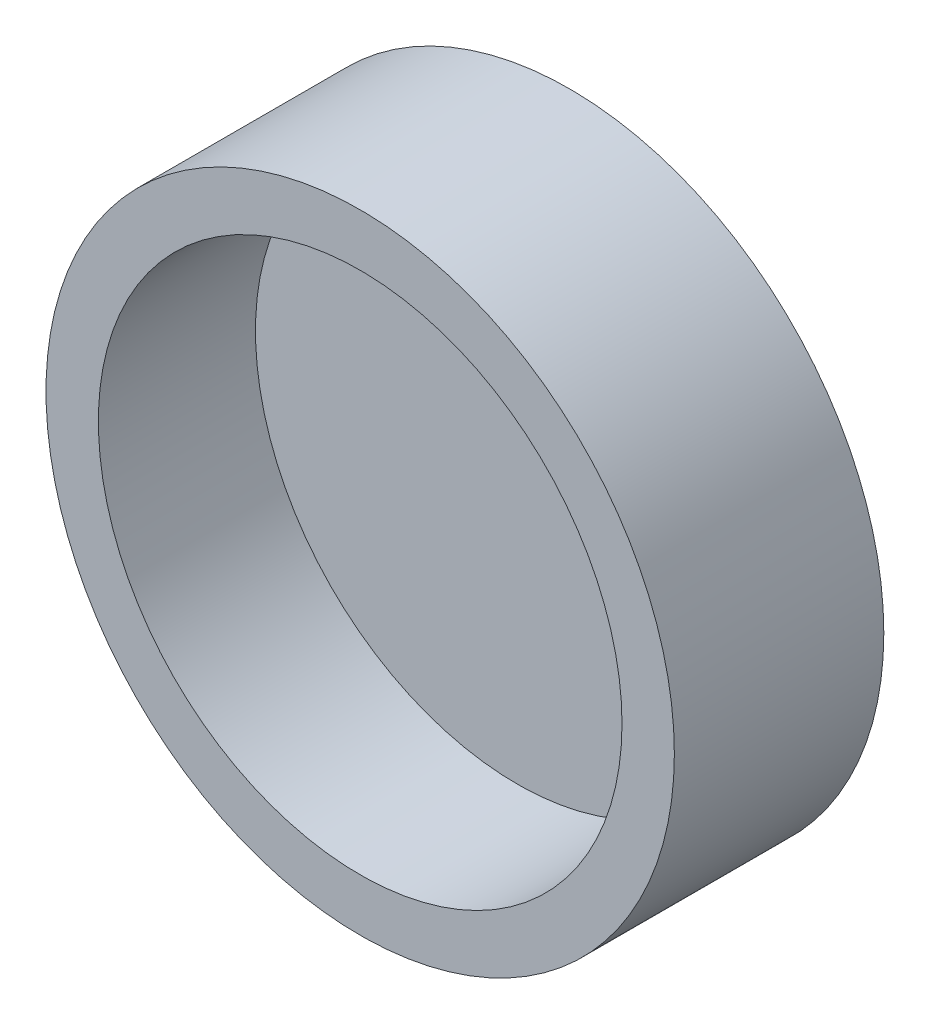
ISO-10303-21;
HEADER;
FILE_DESCRIPTION(('STEP AP214'),'2;1');
FILE_NAME('part.step','',(''),(''),'','','');
FILE_SCHEMA(('AUTOMOTIVE_DESIGN { 1 0 10303 214 1 1 1 1 }'));
ENDSEC;
DATA;
#1=APPLICATION_CONTEXT('core data for automotive mechanical design processes');
#2=APPLICATION_PROTOCOL_DEFINITION('international standard','automotive_design',2000,#1);
#3=PRODUCT_CONTEXT('',#1,'mechanical');
#4=PRODUCT('Part','Part','',(#3));
#5=PRODUCT_RELATED_PRODUCT_CATEGORY('part','',(#4));
#6=PRODUCT_DEFINITION_FORMATION('','',#4);
#7=PRODUCT_DEFINITION_CONTEXT('part definition',#1,'design');
#8=PRODUCT_DEFINITION('design','',#6,#7);
#9=PRODUCT_DEFINITION_SHAPE('','',#8);
#10=(LENGTH_UNIT() NAMED_UNIT(*) SI_UNIT(.MILLI.,.METRE.));
#11=(NAMED_UNIT(*) PLANE_ANGLE_UNIT() SI_UNIT($,.RADIAN.));
#12=(NAMED_UNIT(*) SI_UNIT($,.STERADIAN.) SOLID_ANGLE_UNIT());
#13=UNCERTAINTY_MEASURE_WITH_UNIT(LENGTH_MEASURE(1.E-05),#10,'distance_accuracy_value','');
#14=(GEOMETRIC_REPRESENTATION_CONTEXT(3) GLOBAL_UNCERTAINTY_ASSIGNED_CONTEXT((#13)) GLOBAL_UNIT_ASSIGNED_CONTEXT((#10,
#11,#12)) REPRESENTATION_CONTEXT('',''));
#15=CARTESIAN_POINT('',(0.,0.,0.));
#16=DIRECTION('',(0.,0.,1.));
#17=DIRECTION('',(1.,0.,0.));
#18=AXIS2_PLACEMENT_3D('',#15,#16,#17);
#19=CARTESIAN_POINT('',(0.,0.,40.));
#20=DIRECTION('',(0.,0.,-1.));
#21=DIRECTION('',(-1.,0.,0.));
#22=AXIS2_PLACEMENT_3D('',#19,#20,#21);
#23=CYLINDRICAL_SURFACE('',#22,60.);
#24=CARTESIAN_POINT('',(0.,0.,40.));
#25=DIRECTION('',(0.,0.,1.));
#26=DIRECTION('',(1.,0.,0.));
#27=AXIS2_PLACEMENT_3D('',#24,#25,#26);
#28=CIRCLE('',#27,60.);
#29=CARTESIAN_POINT('',(60.,0.,40.));
#30=VERTEX_POINT('',#29);
#31=EDGE_CURVE('E10',#30,#30,#28,.T.);
#32=ORIENTED_EDGE('',*,*,#31,.F.);
#33=EDGE_LOOP('',(#32));
#34=FACE_BOUND('',#33,.T.);
#35=CARTESIAN_POINT('',(0.,0.,0.));
#36=DIRECTION('',(0.,0.,1.));
#37=DIRECTION('',(1.,0.,0.));
#38=AXIS2_PLACEMENT_3D('',#35,#36,#37);
#39=CIRCLE('',#38,60.);
#40=CARTESIAN_POINT('',(60.,0.,0.));
#41=VERTEX_POINT('',#40);
#42=EDGE_CURVE('E34',#41,#41,#39,.T.);
#43=ORIENTED_EDGE('',*,*,#42,.T.);
#44=EDGE_LOOP('',(#43));
#45=FACE_BOUND('',#44,.T.);
#46=ADVANCED_FACE('F31',(#34,#45),#23,.T.);
#47=CARTESIAN_POINT('',(0.,0.,40.));
#48=DIRECTION('',(0.,0.,1.));
#49=DIRECTION('',(1.,0.,0.));
#50=AXIS2_PLACEMENT_3D('',#47,#48,#49);
#51=PLANE('',#50);
#52=CARTESIAN_POINT('',(0.,0.,40.));
#53=DIRECTION('',(0.,0.,1.));
#54=DIRECTION('',(1.,0.,0.));
#55=AXIS2_PLACEMENT_3D('',#52,#53,#54);
#56=CIRCLE('',#55,50.);
#57=CARTESIAN_POINT('',(50.,0.,40.));
#58=VERTEX_POINT('',#57);
#59=EDGE_CURVE('E43',#58,#58,#56,.T.);
#60=ORIENTED_EDGE('',*,*,#59,.F.);
#61=EDGE_LOOP('',(#60));
#62=FACE_BOUND('',#61,.T.);
#63=ORIENTED_EDGE('',*,*,#31,.T.);
#64=EDGE_LOOP('',(#63));
#65=FACE_BOUND('',#64,.T.);
#66=ADVANCED_FACE('F58',(#62,#65),#51,.T.);
#67=CARTESIAN_POINT('',(0.,0.,0.));
#68=DIRECTION('',(0.,0.,1.));
#69=DIRECTION('',(1.,0.,0.));
#70=AXIS2_PLACEMENT_3D('',#67,#68,#69);
#71=PLANE('',#70);
#72=ORIENTED_EDGE('',*,*,#42,.F.);
#73=EDGE_LOOP('',(#72));
#74=FACE_BOUND('',#73,.T.);
#75=ADVANCED_FACE('F54',(#74),#71,.F.);
#76=CARTESIAN_POINT('',(0.,0.,10.));
#77=DIRECTION('',(0.,0.,1.));
#78=DIRECTION('',(1.,0.,0.));
#79=AXIS2_PLACEMENT_3D('',#76,#77,#78);
#80=CYLINDRICAL_SURFACE('',#79,50.);
#81=CARTESIAN_POINT('',(0.,0.,10.));
#82=DIRECTION('',(0.,0.,1.));
#83=DIRECTION('',(1.,0.,0.));
#84=AXIS2_PLACEMENT_3D('',#81,#82,#83);
#85=CIRCLE('',#84,50.);
#86=CARTESIAN_POINT('',(50.,0.,10.));
#87=VERTEX_POINT('',#86);
#88=EDGE_CURVE('E41',#87,#87,#85,.T.);
#89=ORIENTED_EDGE('',*,*,#88,.F.);
#90=EDGE_LOOP('',(#89));
#91=FACE_BOUND('',#90,.T.);
#92=ORIENTED_EDGE('',*,*,#59,.T.);
#93=EDGE_LOOP('',(#92));
#94=FACE_BOUND('',#93,.T.);
#95=ADVANCED_FACE('F51',(#91,#94),#80,.F.);
#96=CARTESIAN_POINT('',(0.,0.,10.));
#97=DIRECTION('',(0.,0.,1.));
#98=DIRECTION('',(1.,0.,0.));
#99=AXIS2_PLACEMENT_3D('',#96,#97,#98);
#100=PLANE('',#99);
#101=ORIENTED_EDGE('',*,*,#88,.T.);
#102=EDGE_LOOP('',(#101));
#103=FACE_BOUND('',#102,.T.);
#104=ADVANCED_FACE('F49',(#103),#100,.T.);
#105=CLOSED_SHELL('',(#46,#66,#75,#95,#104));
#106=MANIFOLD_SOLID_BREP('B2',#105);
#107=ADVANCED_BREP_SHAPE_REPRESENTATION('',(#18,#106),#14);
#108=SHAPE_DEFINITION_REPRESENTATION(#9,#107);
ENDSEC;
END-ISO-10303-21;
